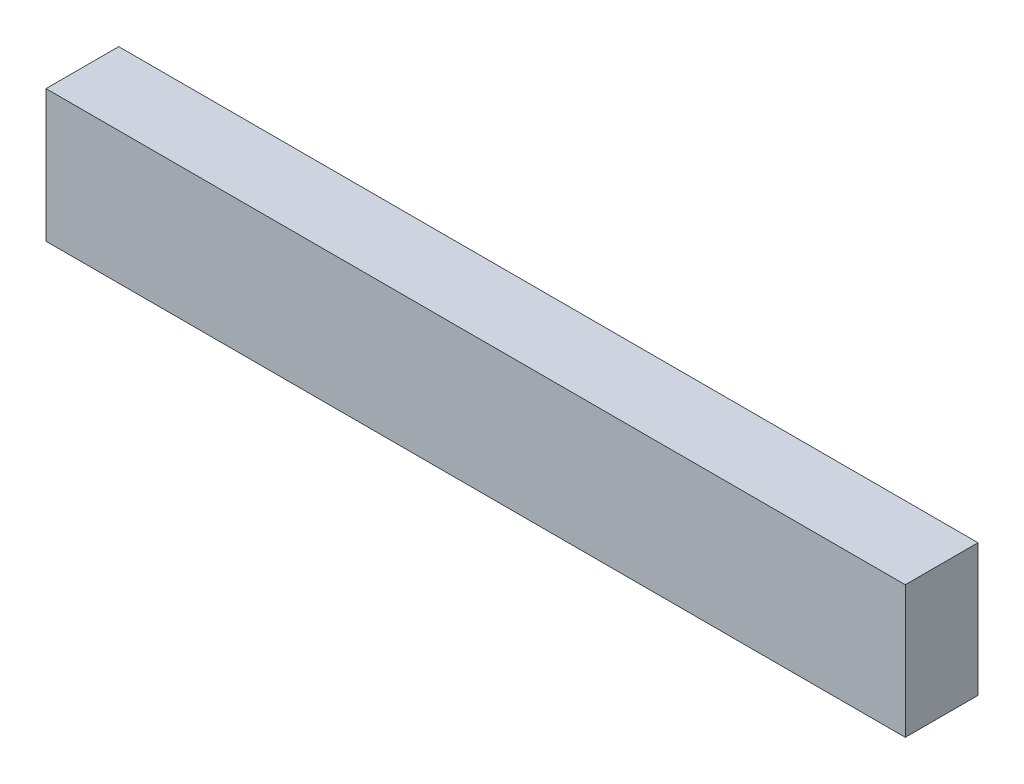
ISO-10303-21;
HEADER;
FILE_DESCRIPTION(('STEP AP214'),'2;1');
FILE_NAME('part.step','',(''),(''),'','','');
FILE_SCHEMA(('AUTOMOTIVE_DESIGN { 1 0 10303 214 1 1 1 1 }'));
ENDSEC;
DATA;
#1=APPLICATION_CONTEXT('core data for automotive mechanical design processes');
#2=APPLICATION_PROTOCOL_DEFINITION('international standard','automotive_design',2000,#1);
#3=PRODUCT_CONTEXT('',#1,'mechanical');
#4=PRODUCT('Part','Part','',(#3));
#5=PRODUCT_RELATED_PRODUCT_CATEGORY('part','',(#4));
#6=PRODUCT_DEFINITION_FORMATION('','',#4);
#7=PRODUCT_DEFINITION_CONTEXT('part definition',#1,'design');
#8=PRODUCT_DEFINITION('design','',#6,#7);
#9=PRODUCT_DEFINITION_SHAPE('','',#8);
#10=(LENGTH_UNIT() NAMED_UNIT(*) SI_UNIT(.MILLI.,.METRE.));
#11=(NAMED_UNIT(*) PLANE_ANGLE_UNIT() SI_UNIT($,.RADIAN.));
#12=(NAMED_UNIT(*) SI_UNIT($,.STERADIAN.) SOLID_ANGLE_UNIT());
#13=UNCERTAINTY_MEASURE_WITH_UNIT(LENGTH_MEASURE(1.E-05),#10,'distance_accuracy_value','');
#14=(GEOMETRIC_REPRESENTATION_CONTEXT(3) GLOBAL_UNCERTAINTY_ASSIGNED_CONTEXT((#13)) GLOBAL_UNIT_ASSIGNED_CONTEXT((#10,
#11,#12)) REPRESENTATION_CONTEXT('',''));
#15=CARTESIAN_POINT('',(0.,0.,0.));
#16=DIRECTION('',(0.,0.,1.));
#17=DIRECTION('',(1.,0.,0.));
#18=AXIS2_PLACEMENT_3D('',#15,#16,#17);
#19=CARTESIAN_POINT('',(3302.,0.,0.));
#20=DIRECTION('',(0.,0.,-1.));
#21=DIRECTION('',(-1.,0.,0.));
#22=AXIS2_PLACEMENT_3D('',#19,#20,#21);
#23=PLANE('',#22);
#24=DIRECTION('',(0.,-1.,0.));
#25=VECTOR('',#24,1.);
#26=CARTESIAN_POINT('',(0.,0.,0.));
#27=LINE('',#26,#25);
#28=CARTESIAN_POINT('',(0.,508.,0.));
#29=VERTEX_POINT('',#28);
#30=CARTESIAN_POINT('',(0.,0.,0.));
#31=VERTEX_POINT('',#30);
#32=EDGE_CURVE('E96',#29,#31,#27,.T.);
#33=ORIENTED_EDGE('',*,*,#32,.T.);
#34=DIRECTION('',(-1.,0.,0.));
#35=VECTOR('',#34,1.);
#36=CARTESIAN_POINT('',(3302.,0.,0.));
#37=LINE('',#36,#35);
#38=CARTESIAN_POINT('',(3302.,0.,0.));
#39=VERTEX_POINT('',#38);
#40=EDGE_CURVE('E11',#39,#31,#37,.T.);
#41=ORIENTED_EDGE('',*,*,#40,.F.);
#42=DIRECTION('',(0.,-1.,0.));
#43=VECTOR('',#42,1.);
#44=CARTESIAN_POINT('',(3302.,0.,0.));
#45=LINE('',#44,#43);
#46=CARTESIAN_POINT('',(3302.,508.,0.));
#47=VERTEX_POINT('',#46);
#48=EDGE_CURVE('E84',#47,#39,#45,.T.);
#49=ORIENTED_EDGE('',*,*,#48,.F.);
#50=DIRECTION('',(-1.,0.,0.));
#51=VECTOR('',#50,1.);
#52=CARTESIAN_POINT('',(3302.,508.,0.));
#53=LINE('',#52,#51);
#54=EDGE_CURVE('E92',#47,#29,#53,.T.);
#55=ORIENTED_EDGE('',*,*,#54,.T.);
#56=EDGE_LOOP('',(#33,#41,#49,#55));
#57=FACE_BOUND('',#56,.T.);
#58=ADVANCED_FACE('F33',(#57),#23,.F.);
#59=CARTESIAN_POINT('',(3302.,0.,0.));
#60=DIRECTION('',(0.,1.,0.));
#61=DIRECTION('',(0.,0.,1.));
#62=AXIS2_PLACEMENT_3D('',#59,#60,#61);
#63=PLANE('',#62);
#64=DIRECTION('',(0.,0.,-1.));
#65=VECTOR('',#64,1.);
#66=CARTESIAN_POINT('',(0.,0.,0.));
#67=LINE('',#66,#65);
#68=CARTESIAN_POINT('',(0.,0.,-279.4));
#69=VERTEX_POINT('',#68);
#70=EDGE_CURVE('E88',#31,#69,#67,.T.);
#71=ORIENTED_EDGE('',*,*,#70,.T.);
#72=DIRECTION('',(-1.,0.,0.));
#73=VECTOR('',#72,1.);
#74=CARTESIAN_POINT('',(3302.,0.,-279.4));
#75=LINE('',#74,#73);
#76=CARTESIAN_POINT('',(3302.,0.,-279.4));
#77=VERTEX_POINT('',#76);
#78=EDGE_CURVE('E41',#77,#69,#75,.T.);
#79=ORIENTED_EDGE('',*,*,#78,.F.);
#80=DIRECTION('',(0.,0.,-1.));
#81=VECTOR('',#80,1.);
#82=CARTESIAN_POINT('',(3302.,0.,0.));
#83=LINE('',#82,#81);
#84=EDGE_CURVE('E79',#39,#77,#83,.T.);
#85=ORIENTED_EDGE('',*,*,#84,.F.);
#86=ORIENTED_EDGE('',*,*,#40,.T.);
#87=EDGE_LOOP('',(#71,#79,#85,#86));
#88=FACE_BOUND('',#87,.T.);
#89=ADVANCED_FACE('F87',(#88),#63,.F.);
#90=CARTESIAN_POINT('',(3302.,0.,-279.4));
#91=DIRECTION('',(0.,0.,1.));
#92=DIRECTION('',(1.,0.,0.));
#93=AXIS2_PLACEMENT_3D('',#90,#91,#92);
#94=PLANE('',#93);
#95=DIRECTION('',(0.,1.,0.));
#96=VECTOR('',#95,1.);
#97=CARTESIAN_POINT('',(0.,0.,-279.4));
#98=LINE('',#97,#96);
#99=CARTESIAN_POINT('',(0.,508.,-279.4));
#100=VERTEX_POINT('',#99);
#101=EDGE_CURVE('E66',#69,#100,#98,.T.);
#102=ORIENTED_EDGE('',*,*,#101,.T.);
#103=DIRECTION('',(-1.,0.,0.));
#104=VECTOR('',#103,1.);
#105=CARTESIAN_POINT('',(3302.,508.,-279.4));
#106=LINE('',#105,#104);
#107=CARTESIAN_POINT('',(3302.,508.,-279.4));
#108=VERTEX_POINT('',#107);
#109=EDGE_CURVE('E89',#108,#100,#106,.T.);
#110=ORIENTED_EDGE('',*,*,#109,.F.);
#111=DIRECTION('',(0.,1.,0.));
#112=VECTOR('',#111,1.);
#113=CARTESIAN_POINT('',(3302.,0.,-279.4));
#114=LINE('',#113,#112);
#115=EDGE_CURVE('E82',#77,#108,#114,.T.);
#116=ORIENTED_EDGE('',*,*,#115,.F.);
#117=ORIENTED_EDGE('',*,*,#78,.T.);
#118=EDGE_LOOP('',(#102,#110,#116,#117));
#119=FACE_BOUND('',#118,.T.);
#120=ADVANCED_FACE('F90',(#119),#94,.F.);
#121=CARTESIAN_POINT('',(3302.,508.,0.));
#122=DIRECTION('',(0.,-1.,0.));
#123=DIRECTION('',(0.,0.,-1.));
#124=AXIS2_PLACEMENT_3D('',#121,#122,#123);
#125=PLANE('',#124);
#126=DIRECTION('',(0.,0.,1.));
#127=VECTOR('',#126,1.);
#128=CARTESIAN_POINT('',(0.,508.,0.));
#129=LINE('',#128,#127);
#130=EDGE_CURVE('E72',#100,#29,#129,.T.);
#131=ORIENTED_EDGE('',*,*,#130,.T.);
#132=ORIENTED_EDGE('',*,*,#54,.F.);
#133=DIRECTION('',(0.,0.,1.));
#134=VECTOR('',#133,1.);
#135=CARTESIAN_POINT('',(3302.,508.,0.));
#136=LINE('',#135,#134);
#137=EDGE_CURVE('E49',#108,#47,#136,.T.);
#138=ORIENTED_EDGE('',*,*,#137,.F.);
#139=ORIENTED_EDGE('',*,*,#109,.T.);
#140=EDGE_LOOP('',(#131,#132,#138,#139));
#141=FACE_BOUND('',#140,.T.);
#142=ADVANCED_FACE('F103',(#141),#125,.F.);
#143=CARTESIAN_POINT('',(3302.,0.,0.));
#144=DIRECTION('',(-1.,0.,0.));
#145=DIRECTION('',(0.,0.,1.));
#146=AXIS2_PLACEMENT_3D('',#143,#144,#145);
#147=PLANE('',#146);
#148=ORIENTED_EDGE('',*,*,#48,.T.);
#149=ORIENTED_EDGE('',*,*,#84,.T.);
#150=ORIENTED_EDGE('',*,*,#115,.T.);
#151=ORIENTED_EDGE('',*,*,#137,.T.);
#152=EDGE_LOOP('',(#148,#149,#150,#151));
#153=FACE_BOUND('',#152,.T.);
#154=ADVANCED_FACE('F80',(#153),#147,.F.);
#155=CARTESIAN_POINT('',(0.,0.,0.));
#156=DIRECTION('',(-1.,0.,0.));
#157=DIRECTION('',(0.,0.,1.));
#158=AXIS2_PLACEMENT_3D('',#155,#156,#157);
#159=PLANE('',#158);
#160=ORIENTED_EDGE('',*,*,#32,.F.);
#161=ORIENTED_EDGE('',*,*,#130,.F.);
#162=ORIENTED_EDGE('',*,*,#101,.F.);
#163=ORIENTED_EDGE('',*,*,#70,.F.);
#164=EDGE_LOOP('',(#160,#161,#162,#163));
#165=FACE_BOUND('',#164,.T.);
#166=ADVANCED_FACE('F106',(#165),#159,.T.);
#167=CLOSED_SHELL('',(#58,#89,#120,#142,#154,#166));
#168=MANIFOLD_SOLID_BREP('B2',#167);
#169=ADVANCED_BREP_SHAPE_REPRESENTATION('',(#18,#168),#14);
#170=SHAPE_DEFINITION_REPRESENTATION(#9,#169);
ENDSEC;
END-ISO-10303-21;
